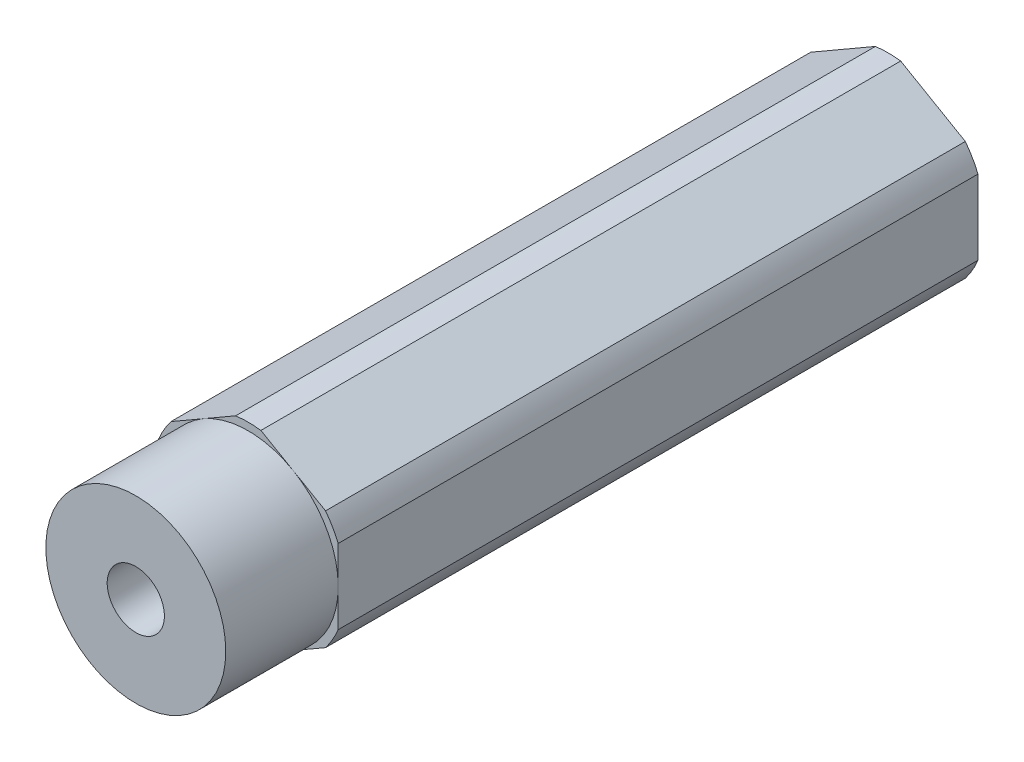
ISO-10303-21;
HEADER;
FILE_DESCRIPTION(('STEP AP214'),'2;1');
FILE_NAME('part.step','',(''),(''),'','','');
FILE_SCHEMA(('AUTOMOTIVE_DESIGN { 1 0 10303 214 1 1 1 1 }'));
ENDSEC;
DATA;
#1=APPLICATION_CONTEXT('core data for automotive mechanical design processes');
#2=APPLICATION_PROTOCOL_DEFINITION('international standard','automotive_design',2000,#1);
#3=PRODUCT_CONTEXT('',#1,'mechanical');
#4=PRODUCT('Part','Part','',(#3));
#5=PRODUCT_RELATED_PRODUCT_CATEGORY('part','',(#4));
#6=PRODUCT_DEFINITION_FORMATION('','',#4);
#7=PRODUCT_DEFINITION_CONTEXT('part definition',#1,'design');
#8=PRODUCT_DEFINITION('design','',#6,#7);
#9=PRODUCT_DEFINITION_SHAPE('','',#8);
#10=(LENGTH_UNIT() NAMED_UNIT(*) SI_UNIT(.MILLI.,.METRE.));
#11=(NAMED_UNIT(*) PLANE_ANGLE_UNIT() SI_UNIT($,.RADIAN.));
#12=(NAMED_UNIT(*) SI_UNIT($,.STERADIAN.) SOLID_ANGLE_UNIT());
#13=UNCERTAINTY_MEASURE_WITH_UNIT(LENGTH_MEASURE(1.E-05),#10,'distance_accuracy_value','');
#14=(GEOMETRIC_REPRESENTATION_CONTEXT(3) GLOBAL_UNCERTAINTY_ASSIGNED_CONTEXT((#13)) GLOBAL_UNIT_ASSIGNED_CONTEXT((#10,
#11,#12)) REPRESENTATION_CONTEXT('',''));
#15=CARTESIAN_POINT('',(0.,0.,0.));
#16=DIRECTION('',(0.,0.,1.));
#17=DIRECTION('',(1.,0.,0.));
#18=AXIS2_PLACEMENT_3D('',#15,#16,#17);
#19=CARTESIAN_POINT('',(6.34999999999999,0.,26.549999986));
#20=DIRECTION('',(-1.,0.,0.));
#21=DIRECTION('',(0.,-1.,0.));
#22=AXIS2_PLACEMENT_3D('',#19,#20,#21);
#23=PLANE('',#22);
#24=DIRECTION('',(0.,1.,0.));
#25=VECTOR('',#24,1.);
#26=CARTESIAN_POINT('',(6.34999999999999,0.,18.612499986));
#27=LINE('',#26,#25);
#28=CARTESIAN_POINT('',(6.35000000000002,-2.63498093588924,18.612499986));
#29=VERTEX_POINT('',#28);
#30=CARTESIAN_POINT('',(6.35,0.,18.612499986));
#31=VERTEX_POINT('',#30);
#32=EDGE_CURVE('E155',#29,#31,#27,.T.);
#33=ORIENTED_EDGE('',*,*,#32,.F.);
#34=DIRECTION('',(0.,0.,-1.));
#35=VECTOR('',#34,1.);
#36=CARTESIAN_POINT('',(6.35000000000002,-2.63498093588924,26.549999986));
#37=LINE('',#36,#35);
#38=CARTESIAN_POINT('',(6.35000000000002,-2.63498093588924,-26.549999986));
#39=VERTEX_POINT('',#38);
#40=EDGE_CURVE('E71',#29,#39,#37,.T.);
#41=ORIENTED_EDGE('',*,*,#40,.T.);
#42=DIRECTION('',(0.,1.,0.));
#43=VECTOR('',#42,1.);
#44=CARTESIAN_POINT('',(6.34999999999999,0.,-26.549999986));
#45=LINE('',#44,#43);
#46=CARTESIAN_POINT('',(6.34999999999997,2.63498093588937,-26.549999986));
#47=VERTEX_POINT('',#46);
#48=EDGE_CURVE('E194',#39,#47,#45,.T.);
#49=ORIENTED_EDGE('',*,*,#48,.T.);
#50=DIRECTION('',(0.,0.,-1.));
#51=VECTOR('',#50,1.);
#52=CARTESIAN_POINT('',(6.34999999999997,2.63498093588937,26.549999986));
#53=LINE('',#52,#51);
#54=CARTESIAN_POINT('',(6.34999999999997,2.63498093588937,18.612499986));
#55=VERTEX_POINT('',#54);
#56=EDGE_CURVE('E56',#55,#47,#53,.T.);
#57=ORIENTED_EDGE('',*,*,#56,.F.);
#58=EDGE_CURVE('E163',#31,#55,#27,.T.);
#59=ORIENTED_EDGE('',*,*,#58,.F.);
#60=EDGE_LOOP('',(#33,#41,#49,#57,#59));
#61=FACE_BOUND('',#60,.T.);
#62=ADVANCED_FACE('F48',(#61),#23,.F.);
#63=CARTESIAN_POINT('',(0.,0.,26.549999986));
#64=DIRECTION('',(0.,0.,-1.));
#65=DIRECTION('',(-1.,0.,0.));
#66=AXIS2_PLACEMENT_3D('',#63,#64,#65);
#67=CYLINDRICAL_SURFACE('',#66,6.874999966);
#68=CARTESIAN_POINT('',(0.,0.,18.612499986));
#69=DIRECTION('',(0.,0.,1.));
#70=DIRECTION('',(1.,0.,0.));
#71=AXIS2_PLACEMENT_3D('',#68,#69,#70);
#72=CIRCLE('',#71,6.874999966);
#73=CARTESIAN_POINT('',(5.45696042896776,4.18177084608662,18.612499986));
#74=VERTEX_POINT('',#73);
#75=EDGE_CURVE('E243',#55,#74,#72,.T.);
#76=ORIENTED_EDGE('',*,*,#75,.F.);
#77=ORIENTED_EDGE('',*,*,#56,.T.);
#78=CARTESIAN_POINT('',(0.,0.,-26.549999986));
#79=DIRECTION('',(0.,0.,1.));
#80=DIRECTION('',(1.,0.,0.));
#81=AXIS2_PLACEMENT_3D('',#78,#79,#80);
#82=CIRCLE('',#81,6.874999966);
#83=CARTESIAN_POINT('',(5.45696042896777,4.18177084608661,-26.549999986));
#84=VERTEX_POINT('',#83);
#85=EDGE_CURVE('E196',#47,#84,#82,.T.);
#86=ORIENTED_EDGE('',*,*,#85,.T.);
#87=DIRECTION('',(0.,0.,-1.));
#88=VECTOR('',#87,1.);
#89=CARTESIAN_POINT('',(5.45696042896777,4.18177084608661,26.549999986));
#90=LINE('',#89,#88);
#91=EDGE_CURVE('E237',#74,#84,#90,.T.);
#92=ORIENTED_EDGE('',*,*,#91,.F.);
#93=EDGE_LOOP('',(#76,#77,#86,#92));
#94=FACE_BOUND('',#93,.T.);
#95=ADVANCED_FACE('F240',(#94),#67,.T.);
#96=CARTESIAN_POINT('',(3.17499999999998,5.49926131403122,26.549999986));
#97=DIRECTION('',(-0.499999999999995,-0.866025403784441,0.));
#98=DIRECTION('',(0.866025403784442,-0.499999999999995,0.));
#99=AXIS2_PLACEMENT_3D('',#96,#97,#98);
#100=PLANE('',#99);
#101=DIRECTION('',(-0.866025403784442,0.499999999999995,0.));
#102=VECTOR('',#101,1.);
#103=CARTESIAN_POINT('',(3.17499999999998,5.49926131403122,18.612499986));
#104=LINE('',#103,#102);
#105=CARTESIAN_POINT('',(3.17499999999997,5.4992613140312,18.612499986));
#106=VERTEX_POINT('',#105);
#107=EDGE_CURVE('E180',#74,#106,#104,.T.);
#108=ORIENTED_EDGE('',*,*,#107,.F.);
#109=ORIENTED_EDGE('',*,*,#91,.T.);
#110=DIRECTION('',(-0.866025403784442,0.499999999999995,0.));
#111=VECTOR('',#110,1.);
#112=CARTESIAN_POINT('',(3.17499999999998,5.49926131403122,-26.549999986));
#113=LINE('',#112,#111);
#114=CARTESIAN_POINT('',(0.893039571032191,6.81675178197583,-26.549999986));
#115=VERTEX_POINT('',#114);
#116=EDGE_CURVE('E199',#84,#115,#113,.T.);
#117=ORIENTED_EDGE('',*,*,#116,.T.);
#118=DIRECTION('',(0.,0.,-1.));
#119=VECTOR('',#118,1.);
#120=CARTESIAN_POINT('',(0.893039571032191,6.81675178197583,26.549999986));
#121=LINE('',#120,#119);
#122=CARTESIAN_POINT('',(0.893039571032191,6.81675178197583,18.612499986));
#123=VERTEX_POINT('',#122);
#124=EDGE_CURVE('E235',#123,#115,#121,.T.);
#125=ORIENTED_EDGE('',*,*,#124,.F.);
#126=EDGE_CURVE('E184',#106,#123,#104,.T.);
#127=ORIENTED_EDGE('',*,*,#126,.F.);
#128=EDGE_LOOP('',(#108,#109,#117,#125,#127));
#129=FACE_BOUND('',#128,.T.);
#130=ADVANCED_FACE('F253',(#129),#100,.F.);
#131=CARTESIAN_POINT('',(-0.893039571032176,6.81675178197583,18.612499986));
#132=VERTEX_POINT('',#131);
#133=EDGE_CURVE('E269',#123,#132,#72,.T.);
#134=ORIENTED_EDGE('',*,*,#133,.F.);
#135=ORIENTED_EDGE('',*,*,#124,.T.);
#136=CARTESIAN_POINT('',(-0.893039571032176,6.81675178197583,-26.549999986));
#137=VERTEX_POINT('',#136);
#138=EDGE_CURVE('E200',#115,#137,#82,.T.);
#139=ORIENTED_EDGE('',*,*,#138,.T.);
#140=DIRECTION('',(0.,0.,-1.));
#141=VECTOR('',#140,1.);
#142=CARTESIAN_POINT('',(-0.893039571032176,6.81675178197583,26.549999986));
#143=LINE('',#142,#141);
#144=EDGE_CURVE('E233',#132,#137,#143,.T.);
#145=ORIENTED_EDGE('',*,*,#144,.F.);
#146=EDGE_LOOP('',(#134,#135,#139,#145));
#147=FACE_BOUND('',#146,.T.);
#148=ADVANCED_FACE('F316',(#147),#67,.T.);
#149=CARTESIAN_POINT('',(-3.175,5.49926131403118,26.549999986));
#150=DIRECTION('',(0.500000000000001,-0.866025403784438,0.));
#151=DIRECTION('',(0.866025403784438,0.500000000000001,0.));
#152=AXIS2_PLACEMENT_3D('',#149,#150,#151);
#153=PLANE('',#152);
#154=DIRECTION('',(-0.866025403784438,-0.500000000000001,0.));
#155=VECTOR('',#154,1.);
#156=CARTESIAN_POINT('',(-3.175,5.49926131403118,18.612499986));
#157=LINE('',#156,#155);
#158=CARTESIAN_POINT('',(-3.17500000000001,5.49926131403118,18.612499986));
#159=VERTEX_POINT('',#158);
#160=EDGE_CURVE('E256',#132,#159,#157,.T.);
#161=ORIENTED_EDGE('',*,*,#160,.F.);
#162=ORIENTED_EDGE('',*,*,#144,.T.);
#163=DIRECTION('',(-0.866025403784438,-0.500000000000001,0.));
#164=VECTOR('',#163,1.);
#165=CARTESIAN_POINT('',(-3.175,5.49926131403118,-26.549999986));
#166=LINE('',#165,#164);
#167=CARTESIAN_POINT('',(-5.45696042896783,4.18177084608652,-26.549999986));
#168=VERTEX_POINT('',#167);
#169=EDGE_CURVE('E203',#137,#168,#166,.T.);
#170=ORIENTED_EDGE('',*,*,#169,.T.);
#171=DIRECTION('',(0.,0.,-1.));
#172=VECTOR('',#171,1.);
#173=CARTESIAN_POINT('',(-5.45696042896783,4.18177084608652,26.549999986));
#174=LINE('',#173,#172);
#175=CARTESIAN_POINT('',(-5.45696042896783,4.18177084608652,18.612499986));
#176=VERTEX_POINT('',#175);
#177=EDGE_CURVE('E231',#176,#168,#174,.T.);
#178=ORIENTED_EDGE('',*,*,#177,.F.);
#179=EDGE_CURVE('E257',#159,#176,#157,.T.);
#180=ORIENTED_EDGE('',*,*,#179,.F.);
#181=EDGE_LOOP('',(#161,#162,#170,#178,#180));
#182=FACE_BOUND('',#181,.T.);
#183=ADVANCED_FACE('F313',(#182),#153,.F.);
#184=CARTESIAN_POINT('',(-6.35,2.63498093588928,18.612499986));
#185=VERTEX_POINT('',#184);
#186=EDGE_CURVE('E270',#176,#185,#72,.T.);
#187=ORIENTED_EDGE('',*,*,#186,.F.);
#188=ORIENTED_EDGE('',*,*,#177,.T.);
#189=CARTESIAN_POINT('',(-6.35,2.63498093588928,-26.549999986));
#190=VERTEX_POINT('',#189);
#191=EDGE_CURVE('E206',#168,#190,#82,.T.);
#192=ORIENTED_EDGE('',*,*,#191,.T.);
#193=DIRECTION('',(0.,0.,-1.));
#194=VECTOR('',#193,1.);
#195=CARTESIAN_POINT('',(-6.35,2.63498093588928,26.549999986));
#196=LINE('',#195,#194);
#197=EDGE_CURVE('E229',#185,#190,#196,.T.);
#198=ORIENTED_EDGE('',*,*,#197,.F.);
#199=EDGE_LOOP('',(#187,#188,#192,#198));
#200=FACE_BOUND('',#199,.T.);
#201=ADVANCED_FACE('F293',(#200),#67,.T.);
#202=CARTESIAN_POINT('',(-6.34999999999999,0.,26.549999986));
#203=DIRECTION('',(1.,0.,0.));
#204=DIRECTION('',(0.,1.,0.));
#205=AXIS2_PLACEMENT_3D('',#202,#203,#204);
#206=PLANE('',#205);
#207=DIRECTION('',(0.,-1.,0.));
#208=VECTOR('',#207,1.);
#209=CARTESIAN_POINT('',(-6.34999999999999,0.,18.612499986));
#210=LINE('',#209,#208);
#211=CARTESIAN_POINT('',(-6.35,0.,18.612499986));
#212=VERTEX_POINT('',#211);
#213=EDGE_CURVE('E260',#185,#212,#210,.T.);
#214=ORIENTED_EDGE('',*,*,#213,.F.);
#215=ORIENTED_EDGE('',*,*,#197,.T.);
#216=DIRECTION('',(0.,-1.,0.));
#217=VECTOR('',#216,1.);
#218=CARTESIAN_POINT('',(-6.34999999999999,0.,-26.549999986));
#219=LINE('',#218,#217);
#220=CARTESIAN_POINT('',(-6.34999999999999,-2.63498093588933,-26.549999986));
#221=VERTEX_POINT('',#220);
#222=EDGE_CURVE('E207',#190,#221,#219,.T.);
#223=ORIENTED_EDGE('',*,*,#222,.T.);
#224=DIRECTION('',(0.,0.,-1.));
#225=VECTOR('',#224,1.);
#226=CARTESIAN_POINT('',(-6.34999999999999,-2.63498093588933,26.549999986));
#227=LINE('',#226,#225);
#228=CARTESIAN_POINT('',(-6.34999999999999,-2.63498093588933,18.612499986));
#229=VERTEX_POINT('',#228);
#230=EDGE_CURVE('E227',#229,#221,#227,.T.);
#231=ORIENTED_EDGE('',*,*,#230,.F.);
#232=EDGE_CURVE('E262',#212,#229,#210,.T.);
#233=ORIENTED_EDGE('',*,*,#232,.F.);
#234=EDGE_LOOP('',(#214,#215,#223,#231,#233));
#235=FACE_BOUND('',#234,.T.);
#236=ADVANCED_FACE('F290',(#235),#206,.F.);
#237=CARTESIAN_POINT('',(-5.4569604289678,-4.18177084608656,18.612499986));
#238=VERTEX_POINT('',#237);
#239=EDGE_CURVE('E272',#229,#238,#72,.T.);
#240=ORIENTED_EDGE('',*,*,#239,.F.);
#241=ORIENTED_EDGE('',*,*,#230,.T.);
#242=CARTESIAN_POINT('',(-5.4569604289678,-4.18177084608656,-26.549999986));
#243=VERTEX_POINT('',#242);
#244=EDGE_CURVE('E210',#221,#243,#82,.T.);
#245=ORIENTED_EDGE('',*,*,#244,.T.);
#246=DIRECTION('',(0.,0.,-1.));
#247=VECTOR('',#246,1.);
#248=CARTESIAN_POINT('',(-5.4569604289678,-4.18177084608656,26.549999986));
#249=LINE('',#248,#247);
#250=EDGE_CURVE('E225',#238,#243,#249,.T.);
#251=ORIENTED_EDGE('',*,*,#250,.F.);
#252=EDGE_LOOP('',(#240,#241,#245,#251));
#253=FACE_BOUND('',#252,.T.);
#254=ADVANCED_FACE('F300',(#253),#67,.T.);
#255=CARTESIAN_POINT('',(-3.17499999999996,-5.4992613140312,26.549999986));
#256=DIRECTION('',(0.499999999999995,0.866025403784442,0.));
#257=DIRECTION('',(-0.866025403784442,0.499999999999995,0.));
#258=AXIS2_PLACEMENT_3D('',#255,#256,#257);
#259=PLANE('',#258);
#260=DIRECTION('',(0.866025403784442,-0.499999999999995,0.));
#261=VECTOR('',#260,1.);
#262=CARTESIAN_POINT('',(-3.17499999999996,-5.4992613140312,18.612499986));
#263=LINE('',#262,#261);
#264=CARTESIAN_POINT('',(-3.17499999999997,-5.4992613140312,18.612499986));
#265=VERTEX_POINT('',#264);
#266=EDGE_CURVE('E264',#238,#265,#263,.T.);
#267=ORIENTED_EDGE('',*,*,#266,.F.);
#268=ORIENTED_EDGE('',*,*,#250,.T.);
#269=DIRECTION('',(0.866025403784442,-0.499999999999995,0.));
#270=VECTOR('',#269,1.);
#271=CARTESIAN_POINT('',(-3.17499999999996,-5.4992613140312,-26.549999986));
#272=LINE('',#271,#270);
#273=CARTESIAN_POINT('',(-0.893039571032124,-6.81675178197584,-26.549999986));
#274=VERTEX_POINT('',#273);
#275=EDGE_CURVE('E211',#243,#274,#272,.T.);
#276=ORIENTED_EDGE('',*,*,#275,.T.);
#277=DIRECTION('',(0.,0.,-1.));
#278=VECTOR('',#277,1.);
#279=CARTESIAN_POINT('',(-0.893039571032124,-6.81675178197584,26.549999986));
#280=LINE('',#279,#278);
#281=CARTESIAN_POINT('',(-0.893039571032124,-6.81675178197584,18.612499986));
#282=VERTEX_POINT('',#281);
#283=EDGE_CURVE('E223',#282,#274,#280,.T.);
#284=ORIENTED_EDGE('',*,*,#283,.F.);
#285=EDGE_CURVE('E265',#265,#282,#263,.T.);
#286=ORIENTED_EDGE('',*,*,#285,.F.);
#287=EDGE_LOOP('',(#267,#268,#276,#284,#286));
#288=FACE_BOUND('',#287,.T.);
#289=ADVANCED_FACE('F303',(#288),#259,.F.);
#290=CARTESIAN_POINT('',(0.893039571032223,-6.81675178197582,18.612499986));
#291=VERTEX_POINT('',#290);
#292=EDGE_CURVE('E271',#282,#291,#72,.T.);
#293=ORIENTED_EDGE('',*,*,#292,.F.);
#294=ORIENTED_EDGE('',*,*,#283,.T.);
#295=CARTESIAN_POINT('',(0.893039571032224,-6.81675178197583,-26.549999986));
#296=VERTEX_POINT('',#295);
#297=EDGE_CURVE('E214',#274,#296,#82,.T.);
#298=ORIENTED_EDGE('',*,*,#297,.T.);
#299=DIRECTION('',(0.,0.,-1.));
#300=VECTOR('',#299,1.);
#301=CARTESIAN_POINT('',(0.893039571032224,-6.81675178197583,26.549999986));
#302=LINE('',#301,#300);
#303=EDGE_CURVE('E221',#291,#296,#302,.T.);
#304=ORIENTED_EDGE('',*,*,#303,.F.);
#305=EDGE_LOOP('',(#293,#294,#298,#304));
#306=FACE_BOUND('',#305,.T.);
#307=ADVANCED_FACE('F341',(#306),#67,.T.);
#308=CARTESIAN_POINT('',(3.17500000000004,-5.49926131403116,26.549999986));
#309=DIRECTION('',(-0.500000000000007,0.866025403784435,0.));
#310=DIRECTION('',(-0.866025403784435,-0.500000000000007,0.));
#311=AXIS2_PLACEMENT_3D('',#308,#309,#310);
#312=PLANE('',#311);
#313=DIRECTION('',(0.866025403784435,0.500000000000007,0.));
#314=VECTOR('',#313,1.);
#315=CARTESIAN_POINT('',(3.17500000000004,-5.49926131403116,18.612499986));
#316=LINE('',#315,#314);
#317=CARTESIAN_POINT('',(3.17500000000005,-5.49926131403116,18.612499986));
#318=VERTEX_POINT('',#317);
#319=EDGE_CURVE('E267',#291,#318,#316,.T.);
#320=ORIENTED_EDGE('',*,*,#319,.F.);
#321=ORIENTED_EDGE('',*,*,#303,.T.);
#322=DIRECTION('',(0.866025403784435,0.500000000000007,0.));
#323=VECTOR('',#322,1.);
#324=CARTESIAN_POINT('',(3.17500000000004,-5.49926131403116,-26.549999986));
#325=LINE('',#324,#323);
#326=CARTESIAN_POINT('',(5.45696042896786,-4.18177084608649,-26.549999986));
#327=VERTEX_POINT('',#326);
#328=EDGE_CURVE('E215',#296,#327,#325,.T.);
#329=ORIENTED_EDGE('',*,*,#328,.T.);
#330=DIRECTION('',(0.,0.,-1.));
#331=VECTOR('',#330,1.);
#332=CARTESIAN_POINT('',(5.45696042896786,-4.18177084608649,26.549999986));
#333=LINE('',#332,#331);
#334=CARTESIAN_POINT('',(5.45696042896786,-4.18177084608649,18.612499986));
#335=VERTEX_POINT('',#334);
#336=EDGE_CURVE('E219',#335,#327,#333,.T.);
#337=ORIENTED_EDGE('',*,*,#336,.F.);
#338=EDGE_CURVE('E63',#318,#335,#316,.T.);
#339=ORIENTED_EDGE('',*,*,#338,.F.);
#340=EDGE_LOOP('',(#320,#321,#329,#337,#339));
#341=FACE_BOUND('',#340,.T.);
#342=ADVANCED_FACE('F342',(#341),#312,.F.);
#343=EDGE_CURVE('E160',#335,#29,#72,.T.);
#344=ORIENTED_EDGE('',*,*,#343,.F.);
#345=ORIENTED_EDGE('',*,*,#336,.T.);
#346=EDGE_CURVE('E191',#327,#39,#82,.T.);
#347=ORIENTED_EDGE('',*,*,#346,.T.);
#348=ORIENTED_EDGE('',*,*,#40,.F.);
#349=EDGE_LOOP('',(#344,#345,#347,#348));
#350=FACE_BOUND('',#349,.T.);
#351=ADVANCED_FACE('F331',(#350),#67,.T.);
#352=CARTESIAN_POINT('',(0.,0.,26.549999986));
#353=DIRECTION('',(0.,0.,1.));
#354=DIRECTION('',(1.,0.,0.));
#355=AXIS2_PLACEMENT_3D('',#352,#353,#354);
#356=PLANE('',#355);
#357=CARTESIAN_POINT('',(0.,0.,26.549999986));
#358=DIRECTION('',(0.,0.,1.));
#359=DIRECTION('',(1.,0.,0.));
#360=AXIS2_PLACEMENT_3D('',#357,#358,#359);
#361=CIRCLE('',#360,2.0193);
#362=CARTESIAN_POINT('',(2.0193,0.,26.549999986));
#363=VERTEX_POINT('',#362);
#364=EDGE_CURVE('E188',#363,#363,#361,.T.);
#365=ORIENTED_EDGE('',*,*,#364,.F.);
#366=EDGE_LOOP('',(#365));
#367=FACE_BOUND('',#366,.T.);
#368=CARTESIAN_POINT('',(0.,0.,26.549999986));
#369=DIRECTION('',(0.,0.,1.));
#370=DIRECTION('',(1.,0.,0.));
#371=AXIS2_PLACEMENT_3D('',#368,#369,#370);
#372=CIRCLE('',#371,6.35);
#373=CARTESIAN_POINT('',(6.35,0.,26.549999986));
#374=VERTEX_POINT('',#373);
#375=EDGE_CURVE('E11',#374,#374,#372,.T.);
#376=ORIENTED_EDGE('',*,*,#375,.T.);
#377=EDGE_LOOP('',(#376));
#378=FACE_BOUND('',#377,.T.);
#379=ADVANCED_FACE('F348',(#367,#378),#356,.T.);
#380=CARTESIAN_POINT('',(0.,0.,26.549999986));
#381=DIRECTION('',(0.,0.,-1.));
#382=DIRECTION('',(-1.,0.,0.));
#383=AXIS2_PLACEMENT_3D('',#380,#381,#382);
#384=CYLINDRICAL_SURFACE('',#383,2.0193);
#385=CARTESIAN_POINT('',(0.,0.,-26.549999986));
#386=DIRECTION('',(0.,0.,1.));
#387=DIRECTION('',(1.,0.,0.));
#388=AXIS2_PLACEMENT_3D('',#385,#386,#387);
#389=CIRCLE('',#388,2.0193);
#390=CARTESIAN_POINT('',(2.0193,0.,-26.549999986));
#391=VERTEX_POINT('',#390);
#392=EDGE_CURVE('E162',#391,#391,#389,.T.);
#393=ORIENTED_EDGE('',*,*,#392,.F.);
#394=EDGE_LOOP('',(#393));
#395=FACE_BOUND('',#394,.T.);
#396=ORIENTED_EDGE('',*,*,#364,.T.);
#397=EDGE_LOOP('',(#396));
#398=FACE_BOUND('',#397,.T.);
#399=ADVANCED_FACE('F50',(#395,#398),#384,.F.);
#400=CARTESIAN_POINT('',(0.,0.,-26.549999986));
#401=DIRECTION('',(0.,0.,1.));
#402=DIRECTION('',(1.,0.,0.));
#403=AXIS2_PLACEMENT_3D('',#400,#401,#402);
#404=PLANE('',#403);
#405=ORIENTED_EDGE('',*,*,#392,.T.);
#406=EDGE_LOOP('',(#405));
#407=FACE_BOUND('',#406,.T.);
#408=ORIENTED_EDGE('',*,*,#48,.F.);
#409=ORIENTED_EDGE('',*,*,#346,.F.);
#410=ORIENTED_EDGE('',*,*,#328,.F.);
#411=ORIENTED_EDGE('',*,*,#297,.F.);
#412=ORIENTED_EDGE('',*,*,#275,.F.);
#413=ORIENTED_EDGE('',*,*,#244,.F.);
#414=ORIENTED_EDGE('',*,*,#222,.F.);
#415=ORIENTED_EDGE('',*,*,#191,.F.);
#416=ORIENTED_EDGE('',*,*,#169,.F.);
#417=ORIENTED_EDGE('',*,*,#138,.F.);
#418=ORIENTED_EDGE('',*,*,#116,.F.);
#419=ORIENTED_EDGE('',*,*,#85,.F.);
#420=EDGE_LOOP('',(#408,#409,#410,#411,#412,#413,#414,#415,#416,#417,#418,#419));
#421=FACE_BOUND('',#420,.T.);
#422=ADVANCED_FACE('F246',(#407,#421),#404,.F.);
#423=CARTESIAN_POINT('',(0.,0.,18.612499986));
#424=DIRECTION('',(0.,0.,1.));
#425=DIRECTION('',(1.,0.,0.));
#426=AXIS2_PLACEMENT_3D('',#423,#424,#425);
#427=PLANE('',#426);
#428=ORIENTED_EDGE('',*,*,#32,.T.);
#429=CARTESIAN_POINT('',(0.,0.,18.612499986));
#430=DIRECTION('',(0.,0.,1.));
#431=DIRECTION('',(1.,0.,0.));
#432=AXIS2_PLACEMENT_3D('',#429,#430,#431);
#433=CIRCLE('',#432,6.35);
#434=EDGE_CURVE('E158',#318,#31,#433,.T.);
#435=ORIENTED_EDGE('',*,*,#434,.F.);
#436=ORIENTED_EDGE('',*,*,#338,.T.);
#437=ORIENTED_EDGE('',*,*,#343,.T.);
#438=EDGE_LOOP('',(#428,#435,#436,#437));
#439=FACE_BOUND('',#438,.T.);
#440=ADVANCED_FACE('F157',(#439),#427,.T.);
#441=ORIENTED_EDGE('',*,*,#58,.T.);
#442=ORIENTED_EDGE('',*,*,#75,.T.);
#443=ORIENTED_EDGE('',*,*,#107,.T.);
#444=EDGE_CURVE('E170',#31,#106,#433,.T.);
#445=ORIENTED_EDGE('',*,*,#444,.F.);
#446=EDGE_LOOP('',(#441,#442,#443,#445));
#447=FACE_BOUND('',#446,.T.);
#448=ADVANCED_FACE('F177',(#447),#427,.T.);
#449=ORIENTED_EDGE('',*,*,#126,.T.);
#450=ORIENTED_EDGE('',*,*,#133,.T.);
#451=ORIENTED_EDGE('',*,*,#160,.T.);
#452=EDGE_CURVE('E182',#106,#159,#433,.T.);
#453=ORIENTED_EDGE('',*,*,#452,.F.);
#454=EDGE_LOOP('',(#449,#450,#451,#453));
#455=FACE_BOUND('',#454,.T.);
#456=ADVANCED_FACE('F317',(#455),#427,.T.);
#457=ORIENTED_EDGE('',*,*,#179,.T.);
#458=ORIENTED_EDGE('',*,*,#186,.T.);
#459=ORIENTED_EDGE('',*,*,#213,.T.);
#460=EDGE_CURVE('E311',#159,#212,#433,.T.);
#461=ORIENTED_EDGE('',*,*,#460,.F.);
#462=EDGE_LOOP('',(#457,#458,#459,#461));
#463=FACE_BOUND('',#462,.T.);
#464=ADVANCED_FACE('F282',(#463),#427,.T.);
#465=ORIENTED_EDGE('',*,*,#232,.T.);
#466=ORIENTED_EDGE('',*,*,#239,.T.);
#467=ORIENTED_EDGE('',*,*,#266,.T.);
#468=EDGE_CURVE('E308',#212,#265,#433,.T.);
#469=ORIENTED_EDGE('',*,*,#468,.F.);
#470=EDGE_LOOP('',(#465,#466,#467,#469));
#471=FACE_BOUND('',#470,.T.);
#472=ADVANCED_FACE('F307',(#471),#427,.T.);
#473=ORIENTED_EDGE('',*,*,#285,.T.);
#474=ORIENTED_EDGE('',*,*,#292,.T.);
#475=ORIENTED_EDGE('',*,*,#319,.T.);
#476=EDGE_CURVE('E174',#265,#318,#433,.T.);
#477=ORIENTED_EDGE('',*,*,#476,.F.);
#478=EDGE_LOOP('',(#473,#474,#475,#477));
#479=FACE_BOUND('',#478,.T.);
#480=ADVANCED_FACE('F310',(#479),#427,.T.);
#481=CARTESIAN_POINT('',(0.,0.,18.612499986));
#482=DIRECTION('',(0.,0.,1.));
#483=DIRECTION('',(1.,0.,0.));
#484=AXIS2_PLACEMENT_3D('',#481,#482,#483);
#485=CYLINDRICAL_SURFACE('',#484,6.35);
#486=ORIENTED_EDGE('',*,*,#375,.F.);
#487=EDGE_LOOP('',(#486));
#488=FACE_BOUND('',#487,.T.);
#489=ORIENTED_EDGE('',*,*,#434,.T.);
#490=ORIENTED_EDGE('',*,*,#444,.T.);
#491=ORIENTED_EDGE('',*,*,#452,.T.);
#492=ORIENTED_EDGE('',*,*,#460,.T.);
#493=ORIENTED_EDGE('',*,*,#468,.T.);
#494=ORIENTED_EDGE('',*,*,#476,.T.);
#495=EDGE_LOOP('',(#489,#490,#491,#492,#493,#494));
#496=FACE_BOUND('',#495,.T.);
#497=ADVANCED_FACE('F168',(#488,#496),#485,.T.);
#498=CLOSED_SHELL('',(#62,#95,#130,#148,#183,#201,#236,#254,#289,#307,#342,#351,#379,#399,#422,
#440,#448,#456,#464,#472,#480,#497));
#499=MANIFOLD_SOLID_BREP('B2',#498);
#500=ADVANCED_BREP_SHAPE_REPRESENTATION('',(#18,#499),#14);
#501=SHAPE_DEFINITION_REPRESENTATION(#9,#500);
ENDSEC;
END-ISO-10303-21;
